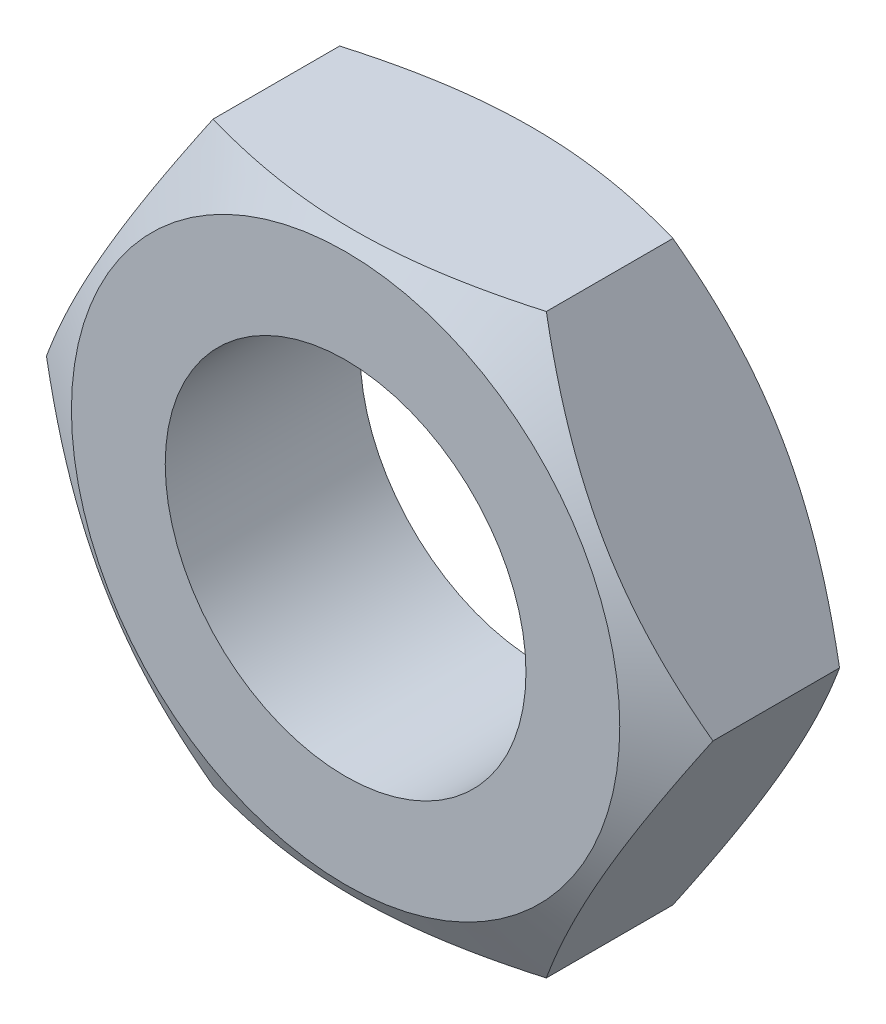
ISO-10303-21;
HEADER;
FILE_DESCRIPTION(('STEP AP214'),'2;1');
FILE_NAME('part.step','',(''),(''),'','','');
FILE_SCHEMA(('AUTOMOTIVE_DESIGN { 1 0 10303 214 1 1 1 1 }'));
ENDSEC;
DATA;
#1=APPLICATION_CONTEXT('core data for automotive mechanical design processes');
#2=APPLICATION_PROTOCOL_DEFINITION('international standard','automotive_design',2000,#1);
#3=PRODUCT_CONTEXT('',#1,'mechanical');
#4=PRODUCT('Part','Part','',(#3));
#5=PRODUCT_RELATED_PRODUCT_CATEGORY('part','',(#4));
#6=PRODUCT_DEFINITION_FORMATION('','',#4);
#7=PRODUCT_DEFINITION_CONTEXT('part definition',#1,'design');
#8=PRODUCT_DEFINITION('design','',#6,#7);
#9=PRODUCT_DEFINITION_SHAPE('','',#8);
#10=(LENGTH_UNIT() NAMED_UNIT(*) SI_UNIT(.MILLI.,.METRE.));
#11=(NAMED_UNIT(*) PLANE_ANGLE_UNIT() SI_UNIT($,.RADIAN.));
#12=(NAMED_UNIT(*) SI_UNIT($,.STERADIAN.) SOLID_ANGLE_UNIT());
#13=UNCERTAINTY_MEASURE_WITH_UNIT(LENGTH_MEASURE(1.E-05),#10,'distance_accuracy_value','');
#14=(GEOMETRIC_REPRESENTATION_CONTEXT(3) GLOBAL_UNCERTAINTY_ASSIGNED_CONTEXT((#13)) GLOBAL_UNIT_ASSIGNED_CONTEXT((#10,
#11,#12)) REPRESENTATION_CONTEXT('',''));
#15=CARTESIAN_POINT('',(0.,0.,0.));
#16=DIRECTION('',(0.,0.,1.));
#17=DIRECTION('',(1.,0.,0.));
#18=AXIS2_PLACEMENT_3D('',#15,#16,#17);
#19=CARTESIAN_POINT('',(4.618802153517,0.,-2.7));
#20=DIRECTION('',(0.866025403784439,0.5,0.));
#21=DIRECTION('',(-0.5,0.866025403784439,0.));
#22=AXIS2_PLACEMENT_3D('',#19,#20,#21);
#23=PLANE('',#22);
#24=CARTESIAN_POINT('',(4.61891762357084,-0.000199999999998459,-0.47280231291269));
#25=CARTESIAN_POINT('',(4.5174314838138,0.17557915032323,-0.414187927486206));
#26=CARTESIAN_POINT('',(4.41506932144051,0.352875616326382,-0.360880375300186));
#27=CARTESIAN_POINT('',(4.20857250547739,0.710538593175708,-0.267831724584327));
#28=CARTESIAN_POINT('',(4.10443418285646,0.890911458970152,-0.228123542867628));
#29=CARTESIAN_POINT('',(3.89744813015756,1.24942181870279,-0.166312269118203));
#30=CARTESIAN_POINT('',(3.79463224655059,1.42750415293514,-0.143797785360813));
#31=CARTESIAN_POINT('',(3.58851671999022,1.78450671716651,-0.116920676984506));
#32=CARTESIAN_POINT('',(3.48521782616117,1.9634256496441,-0.112535795264868));
#33=CARTESIAN_POINT('',(3.29219970504619,2.29774284219673,-0.121660126777895));
#34=CARTESIAN_POINT('',(3.20245157692486,2.45319115998707,-0.132929007825919));
#35=CARTESIAN_POINT('',(3.02354002635496,2.76307505563506,-0.168644044636118));
#36=CARTESIAN_POINT('',(2.93437722268072,2.91750956174413,-0.193102399549458));
#37=CARTESIAN_POINT('',(2.75509682012354,3.22803232777458,-0.254246118757214));
#38=CARTESIAN_POINT('',(2.6650019108942,3.3840812880631,-0.291190657492788));
#39=CARTESIAN_POINT('',(2.48615580200001,3.69385183540384,-0.375040126385952));
#40=CARTESIAN_POINT('',(2.39740231122585,3.84757739077378,-0.421925356050665));
#41=CARTESIAN_POINT('',(2.30928560670466,4.0002,-0.472802312912691));
#42=B_SPLINE_CURVE_WITH_KNOTS('',3,(#24,#25,#26,#27,#28,#29,#30,#31,#32,#33,#34,#35,#36,#37,#38,
#39,#40,#41),.UNSPECIFIED.,.F.,.F.,(4,2,2,2,2,2,2,2,4),(0.,0.634047835695966,1.26961969224543,
1.88946157213122,2.50854226669297,3.04757825393386,3.58711366126903,4.13861653143764,
4.68903648037743),.UNSPECIFIED.);
#43=CARTESIAN_POINT('',(4.618802153517,0.,-0.472735643746085));
#44=VERTEX_POINT('',#43);
#45=CARTESIAN_POINT('',(2.3094010767585,4.,-0.472735643746087));
#46=VERTEX_POINT('',#45);
#47=EDGE_CURVE('E53',#44,#46,#42,.T.);
#48=ORIENTED_EDGE('',*,*,#47,.F.);
#49=DIRECTION('',(0.,0.,1.));
#50=VECTOR('',#49,1.);
#51=CARTESIAN_POINT('',(4.618802153517,0.,-2.7));
#52=LINE('',#51,#50);
#53=CARTESIAN_POINT('',(4.618802153517,0.,-2.22726435625392));
#54=VERTEX_POINT('',#53);
#55=EDGE_CURVE('E12',#54,#44,#52,.T.);
#56=ORIENTED_EDGE('',*,*,#55,.F.);
#57=CARTESIAN_POINT('',(4.61891762357084,-0.00019999999999843,-2.22719768708731));
#58=CARTESIAN_POINT('',(4.5174314838138,0.17557915032323,-2.2858120725138));
#59=CARTESIAN_POINT('',(4.41506932144051,0.352875616326382,-2.33911962469982));
#60=CARTESIAN_POINT('',(4.20857250547739,0.710538593175708,-2.43216827541567));
#61=CARTESIAN_POINT('',(4.10443418285646,0.890911458970152,-2.47187645713237));
#62=CARTESIAN_POINT('',(3.89744813015756,1.24942181870279,-2.5336877308818));
#63=CARTESIAN_POINT('',(3.79463224655059,1.42750415293514,-2.55620221463919));
#64=CARTESIAN_POINT('',(3.58851671999022,1.78450671716651,-2.58307932301549));
#65=CARTESIAN_POINT('',(3.48521782616117,1.9634256496441,-2.58746420473513));
#66=CARTESIAN_POINT('',(3.29219970504619,2.29774284219673,-2.57833987322211));
#67=CARTESIAN_POINT('',(3.20245157692486,2.45319115998707,-2.56707099217408));
#68=CARTESIAN_POINT('',(3.02354002635497,2.76307505563506,-2.53135595536388));
#69=CARTESIAN_POINT('',(2.93437722268072,2.91750956174413,-2.50689760045054));
#70=CARTESIAN_POINT('',(2.75509682012354,3.22803232777458,-2.44575388124279));
#71=CARTESIAN_POINT('',(2.6650019108942,3.3840812880631,-2.40880934250721));
#72=CARTESIAN_POINT('',(2.48615580200001,3.69385183540384,-2.32495987361405));
#73=CARTESIAN_POINT('',(2.39740231122585,3.84757739077378,-2.27807464394934));
#74=CARTESIAN_POINT('',(2.30928560670466,4.0002,-2.22719768708731));
#75=B_SPLINE_CURVE_WITH_KNOTS('',3,(#57,#58,#59,#60,#61,#62,#63,#64,#65,#66,#67,#68,#69,#70,#71,
#72,#73,#74),.UNSPECIFIED.,.F.,.F.,(4,2,2,2,2,2,2,2,4),(0.,0.634047835695966,1.26961969224543,
1.88946157213122,2.50854226669297,3.04757825393385,3.58711366126903,4.13861653143763,
4.68903648037743),.UNSPECIFIED.);
#76=CARTESIAN_POINT('',(2.3094010767585,4.,-2.22726435625391));
#77=VERTEX_POINT('',#76);
#78=EDGE_CURVE('E122',#54,#77,#75,.T.);
#79=ORIENTED_EDGE('',*,*,#78,.T.);
#80=DIRECTION('',(0.,0.,1.));
#81=VECTOR('',#80,1.);
#82=CARTESIAN_POINT('',(2.3094010767585,4.,-2.7));
#83=LINE('',#82,#81);
#84=EDGE_CURVE('E40',#77,#46,#83,.T.);
#85=ORIENTED_EDGE('',*,*,#84,.T.);
#86=EDGE_LOOP('',(#48,#56,#79,#85));
#87=FACE_BOUND('',#86,.T.);
#88=ADVANCED_FACE('F36',(#87),#23,.T.);
#89=CARTESIAN_POINT('',(2.3094010767585,-4.,-2.7));
#90=DIRECTION('',(0.866025403784439,-0.5,0.));
#91=DIRECTION('',(0.5,0.866025403784439,0.));
#92=AXIS2_PLACEMENT_3D('',#89,#90,#91);
#93=PLANE('',#92);
#94=CARTESIAN_POINT('',(2.30928560670466,-4.0002,-0.47280231291269));
#95=CARTESIAN_POINT('',(2.4107717464617,-3.82442084967677,-0.414187927486206));
#96=CARTESIAN_POINT('',(2.51313390883499,-3.64712438367362,-0.360880375300186));
#97=CARTESIAN_POINT('',(2.71963072479811,-3.28946140682429,-0.267831724584327));
#98=CARTESIAN_POINT('',(2.82376904741904,-3.10908854102985,-0.228123542867628));
#99=CARTESIAN_POINT('',(3.03075510011795,-2.75057818129721,-0.166312269118203));
#100=CARTESIAN_POINT('',(3.13357098372491,-2.57249584706486,-0.143797785360812));
#101=CARTESIAN_POINT('',(3.33968651028528,-2.21549328283349,-0.116920676984505));
#102=CARTESIAN_POINT('',(3.44298540411434,-2.0365743503559,-0.112535795264867));
#103=CARTESIAN_POINT('',(3.63600352522932,-1.70225715780327,-0.121660126777894));
#104=CARTESIAN_POINT('',(3.72575165335064,-1.54680884001293,-0.132929007825917));
#105=CARTESIAN_POINT('',(3.90466320392054,-1.23692494436494,-0.168644044636116));
#106=CARTESIAN_POINT('',(3.99382600759478,-1.08249043825587,-0.193102399549456));
#107=CARTESIAN_POINT('',(4.17310641015197,-0.77196767222542,-0.254246118757213));
#108=CARTESIAN_POINT('',(4.26320131938131,-0.615918711936896,-0.291190657492786));
#109=CARTESIAN_POINT('',(4.4420474282755,-0.306148164596159,-0.37504012638595));
#110=CARTESIAN_POINT('',(4.53080091904966,-0.152422609226219,-0.421925356050663));
#111=CARTESIAN_POINT('',(4.61891762357084,0.000200000000001527,-0.472802312912689));
#112=B_SPLINE_CURVE_WITH_KNOTS('',3,(#94,#95,#96,#97,#98,#99,#100,#101,#102,#103,#104,#105,#106,
#107,#108,#109,#110,#111),.UNSPECIFIED.,.F.,.F.,(4,2,2,2,2,2,2,2,4),(0.,0.634047835695966,
1.26961969224543,1.88946157213122,2.50854226669297,3.04757825393386,3.58711366126903,
4.13861653143764,4.68903648037743),.UNSPECIFIED.);
#113=CARTESIAN_POINT('',(2.3094010767585,-4.,-0.472735643746086));
#114=VERTEX_POINT('',#113);
#115=EDGE_CURVE('E196',#114,#44,#112,.T.);
#116=ORIENTED_EDGE('',*,*,#115,.F.);
#117=DIRECTION('',(0.,0.,1.));
#118=VECTOR('',#117,1.);
#119=CARTESIAN_POINT('',(2.3094010767585,-4.,-2.7));
#120=LINE('',#119,#118);
#121=CARTESIAN_POINT('',(2.3094010767585,-4.,-2.22726435625391));
#122=VERTEX_POINT('',#121);
#123=EDGE_CURVE('E45',#122,#114,#120,.T.);
#124=ORIENTED_EDGE('',*,*,#123,.F.);
#125=CARTESIAN_POINT('',(2.30928560670466,-4.0002,-2.22719768708731));
#126=CARTESIAN_POINT('',(2.4107717464617,-3.82442084967677,-2.28581207251379));
#127=CARTESIAN_POINT('',(2.51313390883499,-3.64712438367362,-2.33911962469981));
#128=CARTESIAN_POINT('',(2.71963072479811,-3.28946140682429,-2.43216827541567));
#129=CARTESIAN_POINT('',(2.82376904741904,-3.10908854102985,-2.47187645713237));
#130=CARTESIAN_POINT('',(3.03075510011795,-2.75057818129721,-2.5336877308818));
#131=CARTESIAN_POINT('',(3.13357098372491,-2.57249584706486,-2.55620221463919));
#132=CARTESIAN_POINT('',(3.33968651028528,-2.21549328283349,-2.5830793230155));
#133=CARTESIAN_POINT('',(3.44298540411434,-2.0365743503559,-2.58746420473513));
#134=CARTESIAN_POINT('',(3.63600352522932,-1.70225715780327,-2.57833987322211));
#135=CARTESIAN_POINT('',(3.72575165335064,-1.54680884001293,-2.56707099217408));
#136=CARTESIAN_POINT('',(3.90466320392054,-1.23692494436494,-2.53135595536388));
#137=CARTESIAN_POINT('',(3.99382600759478,-1.08249043825587,-2.50689760045054));
#138=CARTESIAN_POINT('',(4.17310641015197,-0.77196767222542,-2.44575388124279));
#139=CARTESIAN_POINT('',(4.26320131938131,-0.615918711936896,-2.40880934250721));
#140=CARTESIAN_POINT('',(4.4420474282755,-0.306148164596159,-2.32495987361405));
#141=CARTESIAN_POINT('',(4.53080091904966,-0.152422609226219,-2.27807464394934));
#142=CARTESIAN_POINT('',(4.61891762357084,0.000200000000001746,-2.22719768708731));
#143=B_SPLINE_CURVE_WITH_KNOTS('',3,(#125,#126,#127,#128,#129,#130,#131,#132,#133,#134,#135,
#136,#137,#138,#139,#140,#141,#142),.UNSPECIFIED.,.F.,.F.,(4,2,2,2,2,2,2,2,4),(0.,
0.634047835695966,1.26961969224543,1.88946157213122,2.50854226669297,3.04757825393386,
3.58711366126903,4.13861653143764,4.68903648037743),.UNSPECIFIED.);
#144=EDGE_CURVE('E132',#122,#54,#143,.T.);
#145=ORIENTED_EDGE('',*,*,#144,.T.);
#146=ORIENTED_EDGE('',*,*,#55,.T.);
#147=EDGE_LOOP('',(#116,#124,#145,#146));
#148=FACE_BOUND('',#147,.T.);
#149=ADVANCED_FACE('F181',(#148),#93,.T.);
#150=CARTESIAN_POINT('',(2.3094010767585,-4.,-2.7));
#151=DIRECTION('',(0.,1.,0.));
#152=DIRECTION('',(0.,0.,1.));
#153=AXIS2_PLACEMENT_3D('',#150,#151,#152);
#154=PLANE('',#153);
#155=ORIENTED_EDGE('',*,*,#123,.T.);
#156=CARTESIAN_POINT('',(-6.22306666389013,-4.,-2.07715621973869));
#157=CARTESIAN_POINT('',(-6.04816316083585,-4.,-1.99223318627449));
#158=CARTESIAN_POINT('',(-5.87286020291232,-4.,-1.90811886121569));
#159=CARTESIAN_POINT('',(-5.5212429655653,-4.,-1.74196217470627));
#160=CARTESIAN_POINT('',(-5.34492853369369,-4.,-1.65992013622249));
#161=CARTESIAN_POINT('',(-4.99017731988395,-4.,-1.49795420776188));
#162=CARTESIAN_POINT('',(-4.81173422178917,-4.,-1.41804410452791));
#163=CARTESIAN_POINT('',(-4.45343527633052,-4.,-1.26146879437188));
#164=CARTESIAN_POINT('',(-4.27357949568487,-4.,-1.18480343528648));
#165=CARTESIAN_POINT('',(-3.90635209147069,-4.,-1.03317192694685));
#166=CARTESIAN_POINT('',(-3.71892482760879,-4.,-0.958339799325904));
#167=CARTESIAN_POINT('',(-3.34188498996632,-4.,-0.814291513798155));
#168=CARTESIAN_POINT('',(-3.1522721748219,-4.,-0.745075983086222));
#169=CARTESIAN_POINT('',(-2.7709078599298,-4.,-0.614062975376169));
#170=CARTESIAN_POINT('',(-2.57916150632359,-4.,-0.552250667975138));
#171=CARTESIAN_POINT('',(-2.1929186258398,-4.,-0.438014245597993));
#172=CARTESIAN_POINT('',(-1.99842297921743,-4.,-0.385587196004615));
#173=CARTESIAN_POINT('',(-1.60762158446245,-4.,-0.292895792064873));
#174=CARTESIAN_POINT('',(-1.41133146944543,-4.,-0.25256673462777));
#175=CARTESIAN_POINT('',(-1.01629017268319,-4.,-0.186348847408301));
#176=CARTESIAN_POINT('',(-0.817539241744451,-4.,-0.160458558210126));
#177=CARTESIAN_POINT('',(-0.421174309879175,-4.,-0.125521614096426));
#178=CARTESIAN_POINT('',(-0.223580028282138,-4.,-0.116256755578083));
#179=CARTESIAN_POINT('',(0.171690953606563,-4.,-0.114780507489012));
#180=CARTESIAN_POINT('',(0.369367655898419,-4.,-0.122569559160006));
#181=CARTESIAN_POINT('',(0.70432384981034,-4.,-0.149664220842452));
#182=CARTESIAN_POINT('',(0.841959713914111,-4.,-0.164821678851629));
#183=CARTESIAN_POINT('',(1.11623127793625,-4.,-0.202471791988035));
#184=CARTESIAN_POINT('',(1.25286684218125,-4.,-0.224965423961957));
#185=CARTESIAN_POINT('',(1.66108240597982,-4.,-0.302268998836937));
#186=CARTESIAN_POINT('',(1.93082590922622,-4.,-0.366888293804209));
#187=CARTESIAN_POINT('',(2.33430322321429,-4.,-0.479059503376214));
#188=CARTESIAN_POINT('',(2.47012356918847,-4.,-0.519534112438021));
#189=CARTESIAN_POINT('',(2.74044446929553,-4.,-0.604712309553022));
#190=CARTESIAN_POINT('',(2.87494501374186,-4.,-0.649415928618981));
#191=CARTESIAN_POINT('',(3.142670047311,-4.,-0.742332478472642));
#192=CARTESIAN_POINT('',(3.27589492259067,-4.,-0.790544306678611));
#193=CARTESIAN_POINT('',(3.54123753060719,-4.,-0.889907385876161));
#194=CARTESIAN_POINT('',(3.67335528495113,-4.,-0.941058579347892));
#195=CARTESIAN_POINT('',(4.01817238998952,-4.,-1.07826440943816));
#196=CARTESIAN_POINT('',(4.23007941260878,-4.,-1.16630801904257));
#197=CARTESIAN_POINT('',(4.65182404632047,-4.,-1.34723580780935));
#198=CARTESIAN_POINT('',(4.86166145991219,-4.,-1.44012044373115));
#199=CARTESIAN_POINT('',(5.27971562078395,-4.,-1.62962054571552));
#200=CARTESIAN_POINT('',(5.48793186177941,-4.,-1.72623712519084));
#201=CARTESIAN_POINT('',(5.90300704483654,-4.,-1.92234882491253));
#202=CARTESIAN_POINT('',(6.10986594942563,-4.,-2.02184402422342));
#203=CARTESIAN_POINT('',(6.522766422381,-4.,-2.22324245325465));
#204=CARTESIAN_POINT('',(6.72880643107999,-4.,-2.32514887436245));
#205=CARTESIAN_POINT('',(7.13997678264673,-4.,-2.5307824539104));
#206=CARTESIAN_POINT('',(7.34510711645957,-4.,-2.63450963042362));
#207=CARTESIAN_POINT('',(7.95929985262222,-4.,-2.94784175824627));
#208=CARTESIAN_POINT('',(8.36724448010055,-4.,-3.15963693324092));
#209=CARTESIAN_POINT('',(9.14032301551453,-4.,-3.5657751899058));
#210=CARTESIAN_POINT('',(9.50565490265404,-4.,-3.75974318749868));
#211=CARTESIAN_POINT('',(10.2350775945187,-4.,-4.15004385802247));
#212=CARTESIAN_POINT('',(10.5991683322628,-4.,-4.34637665606111));
#213=CARTESIAN_POINT('',(11.3252824478946,-4.,-4.74020058273108));
#214=CARTESIAN_POINT('',(11.687308743492,-4.,-4.93768634018559));
#215=CARTESIAN_POINT('',(12.4105844713828,-4.,-5.3340156973512));
#216=CARTESIAN_POINT('',(12.7718339565996,-4.,-5.53285920044096));
#217=CARTESIAN_POINT('',(13.132807420356,-4.,-5.73219940623917));
#218=B_SPLINE_CURVE_WITH_KNOTS('',3,(#156,#157,#158,#159,#160,#161,#162,#163,#164,#165,#166,
#167,#168,#169,#170,#171,#172,#173,#174,#175,#176,#177,#178,#179,#180,#181,#182,#183,#184,#185,
#186,#187,#188,#189,#190,#191,#192,#193,#194,#195,#196,#197,#198,#199,#200,#201,#202,#203,#204,
#205,#206,#207,#208,#209,#210,#211,#212,#213,#214,#215,#216,#217),.UNSPECIFIED.,.F.,.F.,(4,2,2,
2,2,2,2,2,2,2,2,2,2,2,2,2,2,2,2,2,2,2,2,2,2,2,2,2,2,2,4),(0.,0.583298057032648,1.16668646733312,
1.75321670401812,2.3397194046287,2.94509134661158,3.55053079658478,4.15473637009889,
4.75875268711562,5.35947849004896,5.96014356289174,6.55286577811161,7.14560332921982,
7.56080635419075,7.97606468801973,8.80701729814528,9.2321492716616,9.65728436305649,
10.0822864126958,10.5072801483854,11.1956006655692,11.8839862450047,12.5725788127679,
13.2611903114875,13.9507707688599,14.6403580749825,16.0192635693966,17.2601489781786,
18.5011003258178,19.7382605155364,20.9753335641087),.UNSPECIFIED.);
#219=CARTESIAN_POINT('',(-2.3094010767585,-4.,-0.472735643746087));
#220=VERTEX_POINT('',#219);
#221=EDGE_CURVE('E188',#114,#220,#218,.F.);
#222=ORIENTED_EDGE('',*,*,#221,.T.);
#223=DIRECTION('',(0.,0.,1.));
#224=VECTOR('',#223,1.);
#225=CARTESIAN_POINT('',(-2.3094010767585,-4.,-2.7));
#226=LINE('',#225,#224);
#227=CARTESIAN_POINT('',(-2.3094010767585,-4.,-2.22726435625391));
#228=VERTEX_POINT('',#227);
#229=EDGE_CURVE('E111',#228,#220,#226,.T.);
#230=ORIENTED_EDGE('',*,*,#229,.F.);
#231=CARTESIAN_POINT('',(-6.23116690477721,-4.,-0.618908956888226));
#232=CARTESIAN_POINT('',(-6.0561946941632,-4.,-0.703897707125557));
#233=CARTESIAN_POINT('',(-5.88082373593584,-4.,-0.788079445159984));
#234=CARTESIAN_POINT('',(-5.52907231975997,-4.,-0.954375464821885));
#235=CARTESIAN_POINT('',(-5.35269171036528,-4.,-1.03648942575282));
#236=CARTESIAN_POINT('',(-4.99781388162299,-4.,-1.19860345902988));
#237=CARTESIAN_POINT('',(-4.81931038407348,-4.,-1.27858983496516));
#238=CARTESIAN_POINT('',(-4.46089298231089,-4.,-1.43532530406313));
#239=CARTESIAN_POINT('',(-4.28097914446722,-4.,-1.51207454849075));
#240=CARTESIAN_POINT('',(-3.91360487149529,-4.,-1.66389947037554));
#241=CARTESIAN_POINT('',(-3.7260885749077,-4.,-1.73884070907987));
#242=CARTESIAN_POINT('',(-3.34887263096449,-4.,-1.88311842742219));
#243=CARTESIAN_POINT('',(-3.15917274290169,-4.,-1.95245428226145));
#244=CARTESIAN_POINT('',(-2.77763368855128,-4.,-2.08372190891206));
#245=CARTESIAN_POINT('',(-2.58579964231918,-4.,-2.14566841447991));
#246=CARTESIAN_POINT('',(-2.19938014764704,-4.,-2.26018825512826));
#247=CARTESIAN_POINT('',(-2.00479557724391,-4.,-2.31276451161685));
#248=CARTESIAN_POINT('',(-1.61381745440774,-4.,-2.40576625432492));
#249=CARTESIAN_POINT('',(-1.41743964076501,-4.,-2.44625669535145));
#250=CARTESIAN_POINT('',(-1.0222134745139,-4.,-2.51280607626363));
#251=CARTESIAN_POINT('',(-0.823365376182103,-4.,-2.53886648911134));
#252=CARTESIAN_POINT('',(-0.426801625733816,-4.,-2.57413693322722));
#253=CARTESIAN_POINT('',(-0.22910593639676,-4.,-2.58356588096561));
#254=CARTESIAN_POINT('',(0.166381594886168,-4.,-2.58535204511412));
#255=CARTESIAN_POINT('',(0.364173439104715,-4.,-2.57770883622481));
#256=CARTESIAN_POINT('',(0.69908745932346,-4.,-2.55085582248368));
#257=CARTESIAN_POINT('',(0.836564945582611,-4.,-2.53581620044038));
#258=CARTESIAN_POINT('',(1.11052618942443,-4.,-2.49840990747991));
#259=CARTESIAN_POINT('',(1.24700981314823,-4.,-2.47604226758359));
#260=CARTESIAN_POINT('',(1.65477641349246,-4.,-2.39912173334962));
#261=CARTESIAN_POINT('',(1.92423117097824,-4.,-2.33476431033712));
#262=CARTESIAN_POINT('',(2.32728742895189,-4.,-2.22298005561859));
#263=CARTESIAN_POINT('',(2.46297151296575,-4.,-2.18263358346936));
#264=CARTESIAN_POINT('',(2.73302137589088,-4.,-2.0977080856257));
#265=CARTESIAN_POINT('',(2.8673871450606,-4.,-2.05312902868096));
#266=CARTESIAN_POINT('',(3.13484378532378,-4.,-1.96045741819594));
#267=CARTESIAN_POINT('',(3.26793503781221,-4.,-1.91236595541695));
#268=CARTESIAN_POINT('',(3.53301035484716,-4.,-1.81323968343534));
#269=CARTESIAN_POINT('',(3.66499444155406,-4.,-1.76220493330563));
#270=CARTESIAN_POINT('',(4.01125776737216,-4.,-1.6245855411967));
#271=CARTESIAN_POINT('',(4.2247228160942,-4.,-1.53595457481386));
#272=CARTESIAN_POINT('',(4.6495510063104,-4.,-1.35377400656659));
#273=CARTESIAN_POINT('',(4.860913942036,-4.,-1.26022392871418));
#274=CARTESIAN_POINT('',(5.28199711798421,-4.,-1.06933972373572));
#275=CARTESIAN_POINT('',(5.49171683280113,-4.,-0.972004441248266));
#276=CARTESIAN_POINT('',(5.90978176567902,-4.,-0.774419708887438));
#277=CARTESIAN_POINT('',(6.11812694516307,-4.,-0.674170177647712));
#278=CARTESIAN_POINT('',(6.53399444984484,-4.,-0.471235123130598));
#279=CARTESIAN_POINT('',(6.74151517142242,-4.,-0.368546320031498));
#280=CARTESIAN_POINT('',(7.15563784023437,-4.,-0.16133067091403));
#281=CARTESIAN_POINT('',(7.36223977823949,-4.,-0.0568038064842186));
#282=CARTESIAN_POINT('',(7.98083515251787,-4.,0.25894414014919));
#283=CARTESIAN_POINT('',(8.39170103039797,-4.,0.47237339907072));
#284=CARTESIAN_POINT('',(9.16993555316001,-4.,0.881439154059585));
#285=CARTESIAN_POINT('',(9.5375052587993,-4.,1.07669493951856));
#286=CARTESIAN_POINT('',(10.2713996765586,-4.,1.46957877325565));
#287=CARTESIAN_POINT('',(10.6377243198534,-4.,1.66720695002492));
#288=CARTESIAN_POINT('',(11.3682815563623,-4.,2.06361307398719));
#289=CARTESIAN_POINT('',(11.7325171150585,-4.,2.26238556443952));
#290=CARTESIAN_POINT('',(12.4602094115904,-4.,2.66129000186063));
#291=CARTESIAN_POINT('',(12.8236662033603,-4.,2.86142185040107));
#292=CARTESIAN_POINT('',(13.18684679783,-4.,3.06205055216779));
#293=B_SPLINE_CURVE_WITH_KNOTS('',3,(#231,#232,#233,#234,#235,#236,#237,#238,#239,#240,#241,
#242,#243,#244,#245,#246,#247,#248,#249,#250,#251,#252,#253,#254,#255,#256,#257,#258,#259,#260,
#261,#262,#263,#264,#265,#266,#267,#268,#269,#270,#271,#272,#273,#274,#275,#276,#277,#278,#279,
#280,#281,#282,#283,#284,#285,#286,#287,#288,#289,#290,#291,#292),.UNSPECIFIED.,.F.,.F.,(4,2,2,
2,2,2,2,2,2,2,2,2,2,2,2,2,2,2,2,2,2,2,2,2,2,2,2,2,2,2,4),(0.,0.583569560665296,1.16722907796292,
1.75401834875113,2.34078016955861,2.94652188370419,3.5523310234427,4.15691128970906,
4.76130273204318,5.36238485208926,5.96340560465612,6.55645449555858,7.14951816058548,
7.56421071764592,7.97895813138545,8.80888461393811,9.23351492126433,9.65814836399257,
10.0826504949282,10.5071441089063,11.2004545200236,11.8938321418332,12.5874230911347,
13.2810334242557,13.975636056921,14.6702456512313,16.0591877003369,17.307814365389,
18.5565089652371,19.8013361638165,21.0460741679865),.UNSPECIFIED.);
#294=EDGE_CURVE('E171',#122,#228,#293,.F.);
#295=ORIENTED_EDGE('',*,*,#294,.F.);
#296=EDGE_LOOP('',(#155,#222,#230,#295));
#297=FACE_BOUND('',#296,.T.);
#298=ADVANCED_FACE('F177',(#297),#154,.F.);
#299=CARTESIAN_POINT('',(-4.618802153517,0.,-2.7));
#300=DIRECTION('',(-0.866025403784439,-0.499999999999999,0.));
#301=DIRECTION('',(0.5,-0.866025403784439,0.));
#302=AXIS2_PLACEMENT_3D('',#299,#300,#301);
#303=PLANE('',#302);
#304=CARTESIAN_POINT('',(-4.61891762357084,0.000200000000001647,-0.47280231291269));
#305=CARTESIAN_POINT('',(-4.5174314838138,-0.175579150323226,-0.414187927486206));
#306=CARTESIAN_POINT('',(-4.41506932144051,-0.352875616326379,-0.360880375300186));
#307=CARTESIAN_POINT('',(-4.20857250547739,-0.710538593175705,-0.267831724584327));
#308=CARTESIAN_POINT('',(-4.10443418285647,-0.890911458970149,-0.228123542867628));
#309=CARTESIAN_POINT('',(-3.89744813015756,-1.24942181870279,-0.166312269118203));
#310=CARTESIAN_POINT('',(-3.79463224655059,-1.42750415293514,-0.143797785360813));
#311=CARTESIAN_POINT('',(-3.58851671999023,-1.78450671716651,-0.116920676984506));
#312=CARTESIAN_POINT('',(-3.48521782616117,-1.9634256496441,-0.112535795264867));
#313=CARTESIAN_POINT('',(-3.29219970504619,-2.29774284219673,-0.121660126777894));
#314=CARTESIAN_POINT('',(-3.20245157692486,-2.45319115998706,-0.132929007825918));
#315=CARTESIAN_POINT('',(-3.02354002635497,-2.76307505563505,-0.168644044636117));
#316=CARTESIAN_POINT('',(-2.93437722268072,-2.91750956174413,-0.193102399549457));
#317=CARTESIAN_POINT('',(-2.75509682012354,-3.22803232777458,-0.254246118757213));
#318=CARTESIAN_POINT('',(-2.6650019108942,-3.3840812880631,-0.291190657492787));
#319=CARTESIAN_POINT('',(-2.48615580200001,-3.69385183540384,-0.375040126385951));
#320=CARTESIAN_POINT('',(-2.39740231122585,-3.84757739077378,-0.421925356050664));
#321=CARTESIAN_POINT('',(-2.30928560670467,-4.0002,-0.472802312912691));
#322=B_SPLINE_CURVE_WITH_KNOTS('',3,(#304,#305,#306,#307,#308,#309,#310,#311,#312,#313,#314,
#315,#316,#317,#318,#319,#320,#321),.UNSPECIFIED.,.F.,.F.,(4,2,2,2,2,2,2,2,4),(0.,
0.634047835695965,1.26961969224543,1.88946157213122,2.50854226669297,3.04757825393385,
3.58711366126903,4.13861653143763,4.68903648037743),.UNSPECIFIED.);
#323=CARTESIAN_POINT('',(-4.618802153517,0.,-0.472735643746086));
#324=VERTEX_POINT('',#323);
#325=EDGE_CURVE('E107',#324,#220,#322,.T.);
#326=ORIENTED_EDGE('',*,*,#325,.F.);
#327=DIRECTION('',(0.,0.,1.));
#328=VECTOR('',#327,1.);
#329=CARTESIAN_POINT('',(-4.618802153517,0.,-2.7));
#330=LINE('',#329,#328);
#331=CARTESIAN_POINT('',(-4.618802153517,0.,-2.22726435625392));
#332=VERTEX_POINT('',#331);
#333=EDGE_CURVE('E106',#332,#324,#330,.T.);
#334=ORIENTED_EDGE('',*,*,#333,.F.);
#335=CARTESIAN_POINT('',(-4.61891762357084,0.000200000000001618,-2.22719768708731));
#336=CARTESIAN_POINT('',(-4.5174314838138,-0.175579150323226,-2.2858120725138));
#337=CARTESIAN_POINT('',(-4.41506932144051,-0.352875616326379,-2.33911962469982));
#338=CARTESIAN_POINT('',(-4.20857250547739,-0.710538593175705,-2.43216827541567));
#339=CARTESIAN_POINT('',(-4.10443418285646,-0.890911458970149,-2.47187645713237));
#340=CARTESIAN_POINT('',(-3.89744813015756,-1.24942181870279,-2.5336877308818));
#341=CARTESIAN_POINT('',(-3.79463224655059,-1.42750415293514,-2.55620221463919));
#342=CARTESIAN_POINT('',(-3.58851671999023,-1.78450671716651,-2.58307932301549));
#343=CARTESIAN_POINT('',(-3.48521782616117,-1.9634256496441,-2.58746420473513));
#344=CARTESIAN_POINT('',(-3.29219970504619,-2.29774284219673,-2.57833987322211));
#345=CARTESIAN_POINT('',(-3.20245157692486,-2.45319115998706,-2.56707099217408));
#346=CARTESIAN_POINT('',(-3.02354002635497,-2.76307505563505,-2.53135595536388));
#347=CARTESIAN_POINT('',(-2.93437722268073,-2.91750956174413,-2.50689760045054));
#348=CARTESIAN_POINT('',(-2.75509682012354,-3.22803232777458,-2.44575388124279));
#349=CARTESIAN_POINT('',(-2.6650019108942,-3.3840812880631,-2.40880934250721));
#350=CARTESIAN_POINT('',(-2.48615580200001,-3.69385183540384,-2.32495987361405));
#351=CARTESIAN_POINT('',(-2.39740231122585,-3.84757739077378,-2.27807464394934));
#352=CARTESIAN_POINT('',(-2.30928560670467,-4.0002,-2.22719768708731));
#353=B_SPLINE_CURVE_WITH_KNOTS('',3,(#335,#336,#337,#338,#339,#340,#341,#342,#343,#344,#345,
#346,#347,#348,#349,#350,#351,#352),.UNSPECIFIED.,.F.,.F.,(4,2,2,2,2,2,2,2,4),(0.,
0.634047835695966,1.26961969224543,1.88946157213122,2.50854226669297,3.04757825393386,
3.58711366126903,4.13861653143763,4.68903648037743),.UNSPECIFIED.);
#354=EDGE_CURVE('E165',#332,#228,#353,.T.);
#355=ORIENTED_EDGE('',*,*,#354,.T.);
#356=ORIENTED_EDGE('',*,*,#229,.T.);
#357=EDGE_LOOP('',(#326,#334,#355,#356));
#358=FACE_BOUND('',#357,.T.);
#359=ADVANCED_FACE('F180',(#358),#303,.T.);
#360=CARTESIAN_POINT('',(-2.3094010767585,4.,-2.7));
#361=DIRECTION('',(-0.866025403784439,0.5,0.));
#362=DIRECTION('',(-0.5,-0.866025403784439,0.));
#363=AXIS2_PLACEMENT_3D('',#360,#361,#362);
#364=PLANE('',#363);
#365=CARTESIAN_POINT('',(-2.30928560670467,4.0002,-0.472802312912692));
#366=CARTESIAN_POINT('',(-2.4107717464617,3.82442084967677,-0.414187927486207));
#367=CARTESIAN_POINT('',(-2.51313390883499,3.64712438367362,-0.360880375300188));
#368=CARTESIAN_POINT('',(-2.71963072479811,3.28946140682429,-0.267831724584329));
#369=CARTESIAN_POINT('',(-2.82376904741904,3.10908854102985,-0.228123542867629));
#370=CARTESIAN_POINT('',(-3.03075510011795,2.75057818129721,-0.166312269118204));
#371=CARTESIAN_POINT('',(-3.13357098372492,2.57249584706486,-0.143797785360814));
#372=CARTESIAN_POINT('',(-3.33968651028528,2.21549328283349,-0.116920676984506));
#373=CARTESIAN_POINT('',(-3.44298540411434,2.0365743503559,-0.112535795264868));
#374=CARTESIAN_POINT('',(-3.63600352522932,1.70225715780327,-0.121660126777895));
#375=CARTESIAN_POINT('',(-3.72575165335065,1.54680884001293,-0.132929007825919));
#376=CARTESIAN_POINT('',(-3.90466320392054,1.23692494436494,-0.168644044636118));
#377=CARTESIAN_POINT('',(-3.99382600759478,1.08249043825587,-0.193102399549457));
#378=CARTESIAN_POINT('',(-4.17310641015197,0.771967672225422,-0.254246118757213));
#379=CARTESIAN_POINT('',(-4.26320131938131,0.615918711936898,-0.291190657492787));
#380=CARTESIAN_POINT('',(-4.4420474282755,0.306148164596162,-0.37504012638595));
#381=CARTESIAN_POINT('',(-4.53080091904966,0.152422609226222,-0.421925356050664));
#382=CARTESIAN_POINT('',(-4.61891762357084,-0.000199999999998689,-0.47280231291269));
#383=B_SPLINE_CURVE_WITH_KNOTS('',3,(#365,#366,#367,#368,#369,#370,#371,#372,#373,#374,#375,
#376,#377,#378,#379,#380,#381,#382),.UNSPECIFIED.,.F.,.F.,(4,2,2,2,2,2,2,2,4),(0.,
0.634047835695966,1.26961969224543,1.88946157213122,2.50854226669297,3.04757825393386,
3.58711366126903,4.13861653143764,4.68903648037743),.UNSPECIFIED.);
#384=CARTESIAN_POINT('',(-2.309401076759,4.,-0.472735643745756));
#385=VERTEX_POINT('',#384);
#386=EDGE_CURVE('E92',#385,#324,#383,.T.);
#387=ORIENTED_EDGE('',*,*,#386,.F.);
#388=DIRECTION('',(0.,0.,1.));
#389=VECTOR('',#388,1.);
#390=CARTESIAN_POINT('',(-2.3094010767585,4.,-2.7));
#391=LINE('',#390,#389);
#392=CARTESIAN_POINT('',(-2.3094010767585,4.,-2.22726435625391));
#393=VERTEX_POINT('',#392);
#394=EDGE_CURVE('E104',#393,#385,#391,.T.);
#395=ORIENTED_EDGE('',*,*,#394,.F.);
#396=CARTESIAN_POINT('',(-2.30928560670467,4.0002,-2.22719768708731));
#397=CARTESIAN_POINT('',(-2.4107717464617,3.82442084967677,-2.28581207251379));
#398=CARTESIAN_POINT('',(-2.51313390883499,3.64712438367362,-2.33911962469981));
#399=CARTESIAN_POINT('',(-2.71963072479811,3.28946140682429,-2.43216827541567));
#400=CARTESIAN_POINT('',(-2.82376904741904,3.10908854102985,-2.47187645713237));
#401=CARTESIAN_POINT('',(-3.03075510011795,2.75057818129721,-2.5336877308818));
#402=CARTESIAN_POINT('',(-3.13357098372492,2.57249584706486,-2.55620221463919));
#403=CARTESIAN_POINT('',(-3.33968651028528,2.21549328283349,-2.58307932301549));
#404=CARTESIAN_POINT('',(-3.44298540411434,2.0365743503559,-2.58746420473513));
#405=CARTESIAN_POINT('',(-3.63600352522932,1.70225715780327,-2.57833987322211));
#406=CARTESIAN_POINT('',(-3.72575165335064,1.54680884001293,-2.56707099217408));
#407=CARTESIAN_POINT('',(-3.90466320392054,1.23692494436494,-2.53135595536388));
#408=CARTESIAN_POINT('',(-3.99382600759478,1.08249043825587,-2.50689760045054));
#409=CARTESIAN_POINT('',(-4.17310641015197,0.771967672225422,-2.44575388124279));
#410=CARTESIAN_POINT('',(-4.26320131938131,0.615918711936899,-2.40880934250721));
#411=CARTESIAN_POINT('',(-4.4420474282755,0.306148164596162,-2.32495987361405));
#412=CARTESIAN_POINT('',(-4.53080091904966,0.152422609226222,-2.27807464394934));
#413=CARTESIAN_POINT('',(-4.61891762357084,-0.000199999999998686,-2.22719768708731));
#414=B_SPLINE_CURVE_WITH_KNOTS('',3,(#396,#397,#398,#399,#400,#401,#402,#403,#404,#405,#406,
#407,#408,#409,#410,#411,#412,#413),.UNSPECIFIED.,.F.,.F.,(4,2,2,2,2,2,2,2,4),(0.,
0.634047835695966,1.26961969224543,1.88946157213122,2.50854226669297,3.04757825393386,
3.58711366126903,4.13861653143763,4.68903648037743),.UNSPECIFIED.);
#415=EDGE_CURVE('E61',#393,#332,#414,.T.);
#416=ORIENTED_EDGE('',*,*,#415,.T.);
#417=ORIENTED_EDGE('',*,*,#333,.T.);
#418=EDGE_LOOP('',(#387,#395,#416,#417));
#419=FACE_BOUND('',#418,.T.);
#420=ADVANCED_FACE('F103',(#419),#364,.T.);
#421=CARTESIAN_POINT('',(2.3094010767585,4.,-2.7));
#422=DIRECTION('',(0.,1.,0.));
#423=DIRECTION('',(0.,0.,1.));
#424=AXIS2_PLACEMENT_3D('',#421,#422,#423);
#425=PLANE('',#424);
#426=CARTESIAN_POINT('',(-6.22306666389013,4.,-2.0771562197387));
#427=CARTESIAN_POINT('',(-6.04816316083585,4.,-1.9922331862745));
#428=CARTESIAN_POINT('',(-5.87286020291232,4.,-1.90811886121569));
#429=CARTESIAN_POINT('',(-5.52124296556531,4.,-1.74196217470627));
#430=CARTESIAN_POINT('',(-5.34492853369369,4.,-1.65992013622249));
#431=CARTESIAN_POINT('',(-4.99017731988396,4.,-1.49795420776188));
#432=CARTESIAN_POINT('',(-4.81173422178917,4.,-1.41804410452791));
#433=CARTESIAN_POINT('',(-4.45343527633052,4.,-1.26146879437188));
#434=CARTESIAN_POINT('',(-4.27357949568488,4.,-1.18480343528648));
#435=CARTESIAN_POINT('',(-3.90635209147069,4.,-1.03317192694685));
#436=CARTESIAN_POINT('',(-3.71892482760879,4.,-0.958339799325906));
#437=CARTESIAN_POINT('',(-3.34188498996632,4.,-0.814291513798157));
#438=CARTESIAN_POINT('',(-3.1522721748219,4.,-0.745075983086224));
#439=CARTESIAN_POINT('',(-2.7709078599298,4.,-0.61406297537617));
#440=CARTESIAN_POINT('',(-2.57916150632359,4.,-0.552250667975139));
#441=CARTESIAN_POINT('',(-2.1929186258398,4.,-0.438014245597994));
#442=CARTESIAN_POINT('',(-1.99842297921743,4.,-0.385587196004616));
#443=CARTESIAN_POINT('',(-1.60762158446245,4.,-0.292895792064874));
#444=CARTESIAN_POINT('',(-1.41133146944543,4.,-0.252566734627771));
#445=CARTESIAN_POINT('',(-1.01629017268319,4.,-0.186348847408301));
#446=CARTESIAN_POINT('',(-0.817539241744451,4.,-0.160458558210127));
#447=CARTESIAN_POINT('',(-0.421174309879175,4.,-0.125521614096427));
#448=CARTESIAN_POINT('',(-0.223580028282137,4.,-0.116256755578085));
#449=CARTESIAN_POINT('',(0.171690953606563,4.,-0.114780507489013));
#450=CARTESIAN_POINT('',(0.36936765589842,4.,-0.122569559160007));
#451=CARTESIAN_POINT('',(0.704323849810341,4.,-0.149664220842453));
#452=CARTESIAN_POINT('',(0.841959713914112,4.,-0.16482167885163));
#453=CARTESIAN_POINT('',(1.11623127793625,4.,-0.202471791988036));
#454=CARTESIAN_POINT('',(1.25286684218125,4.,-0.224965423961958));
#455=CARTESIAN_POINT('',(1.66108240597983,4.,-0.302268998836938));
#456=CARTESIAN_POINT('',(1.93082590922622,4.,-0.366888293804211));
#457=CARTESIAN_POINT('',(2.33430322321429,4.,-0.479059503376215));
#458=CARTESIAN_POINT('',(2.47012356918847,4.,-0.519534112438021));
#459=CARTESIAN_POINT('',(2.74044446929553,4.,-0.604712309553023));
#460=CARTESIAN_POINT('',(2.87494501374186,4.,-0.649415928618982));
#461=CARTESIAN_POINT('',(3.142670047311,4.,-0.742332478472644));
#462=CARTESIAN_POINT('',(3.27589492259067,4.,-0.790544306678612));
#463=CARTESIAN_POINT('',(3.54123753060719,4.,-0.889907385876162));
#464=CARTESIAN_POINT('',(3.67335528495113,4.,-0.941058579347893));
#465=CARTESIAN_POINT('',(4.01817238998952,4.,-1.07826440943816));
#466=CARTESIAN_POINT('',(4.23007941260879,4.,-1.16630801904257));
#467=CARTESIAN_POINT('',(4.65182404632047,4.,-1.34723580780935));
#468=CARTESIAN_POINT('',(4.8616614599122,4.,-1.44012044373115));
#469=CARTESIAN_POINT('',(5.27971562078396,4.,-1.62962054571553));
#470=CARTESIAN_POINT('',(5.48793186177942,4.,-1.72623712519084));
#471=CARTESIAN_POINT('',(5.90300704483654,4.,-1.92234882491253));
#472=CARTESIAN_POINT('',(6.10986594942563,4.,-2.02184402422343));
#473=CARTESIAN_POINT('',(6.52276642238101,4.,-2.22324245325465));
#474=CARTESIAN_POINT('',(6.72880643108,4.,-2.32514887436245));
#475=CARTESIAN_POINT('',(7.13997678264673,4.,-2.5307824539104));
#476=CARTESIAN_POINT('',(7.34510711645957,4.,-2.63450963042363));
#477=CARTESIAN_POINT('',(7.95929985262223,4.,-2.94784175824628));
#478=CARTESIAN_POINT('',(8.36724448010056,4.,-3.15963693324092));
#479=CARTESIAN_POINT('',(9.14032301551454,4.,-3.56577518990581));
#480=CARTESIAN_POINT('',(9.50565490265405,4.,-3.75974318749868));
#481=CARTESIAN_POINT('',(10.2350775945187,4.,-4.15004385802247));
#482=CARTESIAN_POINT('',(10.5991683322629,4.,-4.34637665606111));
#483=CARTESIAN_POINT('',(11.3252824478946,4.,-4.74020058273108));
#484=CARTESIAN_POINT('',(11.687308743492,4.,-4.93768634018559));
#485=CARTESIAN_POINT('',(12.4105844713828,4.,-5.33401569735121));
#486=CARTESIAN_POINT('',(12.7718339565996,4.,-5.53285920044097));
#487=CARTESIAN_POINT('',(13.132807420356,4.,-5.73219940623917));
#488=B_SPLINE_CURVE_WITH_KNOTS('',3,(#426,#427,#428,#429,#430,#431,#432,#433,#434,#435,#436,
#437,#438,#439,#440,#441,#442,#443,#444,#445,#446,#447,#448,#449,#450,#451,#452,#453,#454,#455,
#456,#457,#458,#459,#460,#461,#462,#463,#464,#465,#466,#467,#468,#469,#470,#471,#472,#473,#474,
#475,#476,#477,#478,#479,#480,#481,#482,#483,#484,#485,#486,#487),.UNSPECIFIED.,.F.,.F.,(4,2,2,
2,2,2,2,2,2,2,2,2,2,2,2,2,2,2,2,2,2,2,2,2,2,2,2,2,2,2,4),(0.,0.583298057032647,1.16668646733312,
1.75321670401812,2.3397194046287,2.94509134661158,3.55053079658478,4.15473637009889,
4.75875268711562,5.35947849004896,5.96014356289174,6.55286577811161,7.14560332921982,
7.56080635419076,7.97606468801973,8.80701729814528,9.2321492716616,9.65728436305649,
10.0822864126958,10.5072801483854,11.1956006655692,11.8839862450047,12.572578812768,
13.2611903114875,13.9507707688599,14.6403580749825,16.0192635693966,17.2601489781786,
18.5011003258178,19.7382605155364,20.9753335641087),.UNSPECIFIED.);
#489=EDGE_CURVE('E88',#46,#385,#488,.F.);
#490=ORIENTED_EDGE('',*,*,#489,.F.);
#491=ORIENTED_EDGE('',*,*,#84,.F.);
#492=CARTESIAN_POINT('',(-6.23116690477721,4.,-0.618908956888226));
#493=CARTESIAN_POINT('',(-6.0561946941632,4.,-0.703897707125557));
#494=CARTESIAN_POINT('',(-5.88082373593584,4.,-0.788079445159983));
#495=CARTESIAN_POINT('',(-5.52907231975997,4.,-0.954375464821885));
#496=CARTESIAN_POINT('',(-5.35269171036528,4.,-1.03648942575282));
#497=CARTESIAN_POINT('',(-4.99781388162299,4.,-1.19860345902988));
#498=CARTESIAN_POINT('',(-4.81931038407348,4.,-1.27858983496516));
#499=CARTESIAN_POINT('',(-4.46089298231089,4.,-1.43532530406313));
#500=CARTESIAN_POINT('',(-4.28097914446722,4.,-1.51207454849075));
#501=CARTESIAN_POINT('',(-3.91360487149529,4.,-1.66389947037554));
#502=CARTESIAN_POINT('',(-3.7260885749077,4.,-1.73884070907987));
#503=CARTESIAN_POINT('',(-3.34887263096449,4.,-1.88311842742219));
#504=CARTESIAN_POINT('',(-3.15917274290169,4.,-1.95245428226145));
#505=CARTESIAN_POINT('',(-2.77763368855128,4.,-2.08372190891206));
#506=CARTESIAN_POINT('',(-2.58579964231918,4.,-2.14566841447991));
#507=CARTESIAN_POINT('',(-2.19938014764704,4.,-2.26018825512826));
#508=CARTESIAN_POINT('',(-2.00479557724391,4.,-2.31276451161685));
#509=CARTESIAN_POINT('',(-1.61381745440774,4.,-2.40576625432492));
#510=CARTESIAN_POINT('',(-1.41743964076501,4.,-2.44625669535145));
#511=CARTESIAN_POINT('',(-1.0222134745139,4.,-2.51280607626362));
#512=CARTESIAN_POINT('',(-0.823365376182102,4.,-2.53886648911134));
#513=CARTESIAN_POINT('',(-0.426801625733815,4.,-2.57413693322722));
#514=CARTESIAN_POINT('',(-0.229105936396759,4.,-2.58356588096561));
#515=CARTESIAN_POINT('',(0.166381594886169,4.,-2.58535204511412));
#516=CARTESIAN_POINT('',(0.364173439104716,4.,-2.57770883622481));
#517=CARTESIAN_POINT('',(0.699087459323461,4.,-2.55085582248368));
#518=CARTESIAN_POINT('',(0.836564945582611,4.,-2.53581620044038));
#519=CARTESIAN_POINT('',(1.11052618942443,4.,-2.4984099074799));
#520=CARTESIAN_POINT('',(1.24700981314823,4.,-2.47604226758359));
#521=CARTESIAN_POINT('',(1.65477641349246,4.,-2.39912173334962));
#522=CARTESIAN_POINT('',(1.92423117097824,4.,-2.33476431033712));
#523=CARTESIAN_POINT('',(2.32728742895189,4.,-2.22298005561858));
#524=CARTESIAN_POINT('',(2.46297151296575,4.,-2.18263358346936));
#525=CARTESIAN_POINT('',(2.73302137589088,4.,-2.0977080856257));
#526=CARTESIAN_POINT('',(2.8673871450606,4.,-2.05312902868096));
#527=CARTESIAN_POINT('',(3.13484378532378,4.,-1.96045741819594));
#528=CARTESIAN_POINT('',(3.26793503781221,4.,-1.91236595541695));
#529=CARTESIAN_POINT('',(3.53301035484716,4.,-1.81323968343534));
#530=CARTESIAN_POINT('',(3.66499444155407,4.,-1.76220493330563));
#531=CARTESIAN_POINT('',(4.01125776737216,4.,-1.6245855411967));
#532=CARTESIAN_POINT('',(4.2247228160942,4.,-1.53595457481386));
#533=CARTESIAN_POINT('',(4.6495510063104,4.,-1.35377400656659));
#534=CARTESIAN_POINT('',(4.860913942036,4.,-1.26022392871418));
#535=CARTESIAN_POINT('',(5.28199711798421,4.,-1.06933972373572));
#536=CARTESIAN_POINT('',(5.49171683280113,4.,-0.972004441248264));
#537=CARTESIAN_POINT('',(5.90978176567903,4.,-0.774419708887436));
#538=CARTESIAN_POINT('',(6.11812694516308,4.,-0.674170177647709));
#539=CARTESIAN_POINT('',(6.53399444984484,4.,-0.471235123130594));
#540=CARTESIAN_POINT('',(6.74151517142242,4.,-0.368546320031494));
#541=CARTESIAN_POINT('',(7.15563784023437,4.,-0.161330670914027));
#542=CARTESIAN_POINT('',(7.3622397782395,4.,-0.0568038064842153));
#543=CARTESIAN_POINT('',(7.98083515251788,4.,0.258944140149192));
#544=CARTESIAN_POINT('',(8.39170103039798,4.,0.472373399070722));
#545=CARTESIAN_POINT('',(9.16993555316002,4.,0.881439154059587));
#546=CARTESIAN_POINT('',(9.53750525879931,4.,1.07669493951856));
#547=CARTESIAN_POINT('',(10.2713996765586,4.,1.46957877325565));
#548=CARTESIAN_POINT('',(10.6377243198534,4.,1.66720695002492));
#549=CARTESIAN_POINT('',(11.3682815563623,4.,2.06361307398719));
#550=CARTESIAN_POINT('',(11.7325171150585,4.,2.26238556443952));
#551=CARTESIAN_POINT('',(12.4602094115904,4.,2.66129000186063));
#552=CARTESIAN_POINT('',(12.8236662033603,4.,2.86142185040108));
#553=CARTESIAN_POINT('',(13.18684679783,4.,3.06205055216779));
#554=B_SPLINE_CURVE_WITH_KNOTS('',3,(#492,#493,#494,#495,#496,#497,#498,#499,#500,#501,#502,
#503,#504,#505,#506,#507,#508,#509,#510,#511,#512,#513,#514,#515,#516,#517,#518,#519,#520,#521,
#522,#523,#524,#525,#526,#527,#528,#529,#530,#531,#532,#533,#534,#535,#536,#537,#538,#539,#540,
#541,#542,#543,#544,#545,#546,#547,#548,#549,#550,#551,#552,#553),.UNSPECIFIED.,.F.,.F.,(4,2,2,
2,2,2,2,2,2,2,2,2,2,2,2,2,2,2,2,2,2,2,2,2,2,2,2,2,2,2,4),(0.,0.583569560665296,1.16722907796292,
1.75401834875113,2.34078016955861,2.94652188370419,3.5523310234427,4.15691128970906,
4.76130273204318,5.36238485208926,5.96340560465612,6.55645449555858,7.14951816058548,
7.56421071764592,7.97895813138545,8.80888461393811,9.23351492126432,9.65814836399257,
10.0826504949282,10.5071441089063,11.2004545200236,11.8938321418332,12.5874230911347,
13.2810334242557,13.975636056921,14.6702456512313,16.0591877003369,17.307814365389,
18.5565089652371,19.8013361638165,21.0460741679865),.UNSPECIFIED.);
#555=EDGE_CURVE('E110',#77,#393,#554,.F.);
#556=ORIENTED_EDGE('',*,*,#555,.T.);
#557=ORIENTED_EDGE('',*,*,#394,.T.);
#558=EDGE_LOOP('',(#490,#491,#556,#557));
#559=FACE_BOUND('',#558,.T.);
#560=ADVANCED_FACE('F109',(#559),#425,.T.);
#561=CARTESIAN_POINT('',(2.3094010767585,4.,-2.7));
#562=DIRECTION('',(0.,0.,1.));
#563=DIRECTION('',(1.,0.,0.));
#564=AXIS2_PLACEMENT_3D('',#561,#562,#563);
#565=PLANE('',#564);
#566=CARTESIAN_POINT('',(0.,0.,-2.7));
#567=DIRECTION('',(0.,0.,1.));
#568=DIRECTION('',(1.,0.,0.));
#569=AXIS2_PLACEMENT_3D('',#566,#567,#568);
#570=CIRCLE('',#569,2.5);
#571=CARTESIAN_POINT('',(2.5,0.,-2.7));
#572=VERTEX_POINT('',#571);
#573=EDGE_CURVE('E113',#572,#572,#570,.T.);
#574=ORIENTED_EDGE('',*,*,#573,.T.);
#575=EDGE_LOOP('',(#574));
#576=FACE_BOUND('',#575,.T.);
#577=CARTESIAN_POINT('',(0.,0.,-2.7));
#578=DIRECTION('',(0.,0.,-1.));
#579=DIRECTION('',(-1.,0.,0.));
#580=AXIS2_PLACEMENT_3D('',#577,#578,#579);
#581=CIRCLE('',#580,3.8);
#582=CARTESIAN_POINT('',(-3.8,0.,-2.7));
#583=VERTEX_POINT('',#582);
#584=EDGE_CURVE('E210',#583,#583,#581,.T.);
#585=ORIENTED_EDGE('',*,*,#584,.T.);
#586=EDGE_LOOP('',(#585));
#587=FACE_BOUND('',#586,.T.);
#588=ADVANCED_FACE('F251',(#576,#587),#565,.F.);
#589=CARTESIAN_POINT('',(2.3094010767585,4.,0.));
#590=DIRECTION('',(0.,0.,1.));
#591=DIRECTION('',(1.,0.,0.));
#592=AXIS2_PLACEMENT_3D('',#589,#590,#591);
#593=PLANE('',#592);
#594=CARTESIAN_POINT('',(0.,0.,0.));
#595=DIRECTION('',(0.,0.,-1.));
#596=DIRECTION('',(-1.,0.,0.));
#597=AXIS2_PLACEMENT_3D('',#594,#595,#596);
#598=CIRCLE('',#597,3.8);
#599=CARTESIAN_POINT('',(-3.8,0.,0.));
#600=VERTEX_POINT('',#599);
#601=EDGE_CURVE('E98',#600,#600,#598,.T.);
#602=ORIENTED_EDGE('',*,*,#601,.F.);
#603=EDGE_LOOP('',(#602));
#604=FACE_BOUND('',#603,.T.);
#605=CARTESIAN_POINT('',(0.,0.,0.));
#606=DIRECTION('',(0.,0.,1.));
#607=DIRECTION('',(1.,0.,0.));
#608=AXIS2_PLACEMENT_3D('',#605,#606,#607);
#609=CIRCLE('',#608,2.5);
#610=CARTESIAN_POINT('',(2.5,0.,0.));
#611=VERTEX_POINT('',#610);
#612=EDGE_CURVE('E119',#611,#611,#609,.T.);
#613=ORIENTED_EDGE('',*,*,#612,.F.);
#614=EDGE_LOOP('',(#613));
#615=FACE_BOUND('',#614,.T.);
#616=ADVANCED_FACE('F258',(#604,#615),#593,.T.);
#617=CARTESIAN_POINT('',(0.,0.,-2.7));
#618=DIRECTION('',(0.,0.,1.));
#619=DIRECTION('',(1.,0.,0.));
#620=AXIS2_PLACEMENT_3D('',#617,#618,#619);
#621=CYLINDRICAL_SURFACE('',#620,2.5);
#622=CARTESIAN_POINT('',(2.5,0.,-2.7));
#623=CARTESIAN_POINT('',(2.5,0.,-2.671875));
#624=CARTESIAN_POINT('',(2.5,0.,-2.64375));
#625=CARTESIAN_POINT('',(2.5,0.,-2.5875));
#626=CARTESIAN_POINT('',(2.5,0.,-2.559375));
#627=CARTESIAN_POINT('',(2.5,0.,-2.503125));
#628=CARTESIAN_POINT('',(2.5,0.,-2.475));
#629=CARTESIAN_POINT('',(2.5,0.,-2.41875));
#630=CARTESIAN_POINT('',(2.5,0.,-2.390625));
#631=CARTESIAN_POINT('',(2.5,0.,-2.334375));
#632=CARTESIAN_POINT('',(2.5,0.,-2.30625));
#633=CARTESIAN_POINT('',(2.5,0.,-2.25));
#634=CARTESIAN_POINT('',(2.5,0.,-2.221875));
#635=CARTESIAN_POINT('',(2.5,0.,-2.165625));
#636=CARTESIAN_POINT('',(2.5,0.,-2.1375));
#637=CARTESIAN_POINT('',(2.5,0.,-2.08125));
#638=CARTESIAN_POINT('',(2.5,0.,-2.053125));
#639=CARTESIAN_POINT('',(2.5,0.,-1.996875));
#640=CARTESIAN_POINT('',(2.5,0.,-1.96875));
#641=CARTESIAN_POINT('',(2.5,0.,-1.9125));
#642=CARTESIAN_POINT('',(2.5,0.,-1.884375));
#643=CARTESIAN_POINT('',(2.5,0.,-1.828125));
#644=CARTESIAN_POINT('',(2.5,0.,-1.8));
#645=CARTESIAN_POINT('',(2.5,0.,-1.74375));
#646=CARTESIAN_POINT('',(2.5,0.,-1.715625));
#647=CARTESIAN_POINT('',(2.5,0.,-1.659375));
#648=CARTESIAN_POINT('',(2.5,0.,-1.63125));
#649=CARTESIAN_POINT('',(2.5,0.,-1.575));
#650=CARTESIAN_POINT('',(2.5,0.,-1.546875));
#651=CARTESIAN_POINT('',(2.5,0.,-1.490625));
#652=CARTESIAN_POINT('',(2.5,0.,-1.4625));
#653=CARTESIAN_POINT('',(2.5,0.,-1.40625));
#654=CARTESIAN_POINT('',(2.5,0.,-1.378125));
#655=CARTESIAN_POINT('',(2.5,0.,-1.321875));
#656=CARTESIAN_POINT('',(2.5,0.,-1.29375));
#657=CARTESIAN_POINT('',(2.5,0.,-1.2375));
#658=CARTESIAN_POINT('',(2.5,0.,-1.209375));
#659=CARTESIAN_POINT('',(2.5,0.,-1.153125));
#660=CARTESIAN_POINT('',(2.5,0.,-1.125));
#661=CARTESIAN_POINT('',(2.5,0.,-1.06875));
#662=CARTESIAN_POINT('',(2.5,0.,-1.040625));
#663=CARTESIAN_POINT('',(2.5,0.,-0.984375));
#664=CARTESIAN_POINT('',(2.5,0.,-0.95625));
#665=CARTESIAN_POINT('',(2.5,0.,-0.9));
#666=CARTESIAN_POINT('',(2.5,0.,-0.871875000000001));
#667=CARTESIAN_POINT('',(2.5,0.,-0.815625));
#668=CARTESIAN_POINT('',(2.5,0.,-0.787500000000001));
#669=CARTESIAN_POINT('',(2.5,0.,-0.731250000000001));
#670=CARTESIAN_POINT('',(2.5,0.,-0.703125000000001));
#671=CARTESIAN_POINT('',(2.5,0.,-0.646875000000001));
#672=CARTESIAN_POINT('',(2.5,0.,-0.61875));
#673=CARTESIAN_POINT('',(2.5,0.,-0.5625));
#674=CARTESIAN_POINT('',(2.5,0.,-0.534375000000001));
#675=CARTESIAN_POINT('',(2.5,0.,-0.478125000000001));
#676=CARTESIAN_POINT('',(2.5,0.,-0.45));
#677=CARTESIAN_POINT('',(2.5,0.,-0.39375));
#678=CARTESIAN_POINT('',(2.5,0.,-0.365625));
#679=CARTESIAN_POINT('',(2.5,0.,-0.309375));
#680=CARTESIAN_POINT('',(2.5,0.,-0.28125));
#681=CARTESIAN_POINT('',(2.5,0.,-0.225));
#682=CARTESIAN_POINT('',(2.5,0.,-0.196875));
#683=CARTESIAN_POINT('',(2.5,0.,-0.140625));
#684=CARTESIAN_POINT('',(2.5,0.,-0.1125));
#685=CARTESIAN_POINT('',(2.5,0.,-0.0562500000000003));
#686=CARTESIAN_POINT('',(2.5,0.,-0.0281250000000003));
#687=CARTESIAN_POINT('',(2.5,0.,0.));
#688=B_SPLINE_CURVE_WITH_KNOTS('',3,(#622,#623,#624,#625,#626,#627,#628,#629,#630,#631,#632,
#633,#634,#635,#636,#637,#638,#639,#640,#641,#642,#643,#644,#645,#646,#647,#648,#649,#650,#651,
#652,#653,#654,#655,#656,#657,#658,#659,#660,#661,#662,#663,#664,#665,#666,#667,#668,#669,#670,
#671,#672,#673,#674,#675,#676,#677,#678,#679,#680,#681,#682,#683,#684,#685,#686,#687),
.UNSPECIFIED.,.F.,.F.,(4,2,2,2,2,2,2,2,2,2,2,2,2,2,2,2,2,2,2,2,2,2,2,2,2,2,2,2,2,2,2,2,4),(0.,
0.0843749999999998,0.16875,0.253125,0.3375,0.421875,0.50625,0.590625,0.675,0.759375,0.84375,
0.928125,1.0125,1.096875,1.18125,1.265625,1.35,1.434375,1.51875,1.603125,1.6875,1.771875,
1.85625,1.940625,2.025,2.109375,2.19375,2.278125,2.3625,2.446875,2.53125,2.615625,2.7),.UNSPECIFIED.);
#689=EDGE_CURVE('BSEAM144',#572,#611,#688,.T.);
#690=ORIENTED_EDGE('',*,*,#573,.F.);
#691=ORIENTED_EDGE('',*,*,#612,.T.);
#692=ORIENTED_EDGE('',*,*,#689,.T.);
#693=ORIENTED_EDGE('',*,*,#689,.F.);
#694=EDGE_LOOP('',(#690,#692,#691,#693));
#695=FACE_BOUND('',#694,.T.);
#696=ADVANCED_FACE('F144',(#695),#621,.F.);
#697=CARTESIAN_POINT('',(0.,0.,-2.7));
#698=DIRECTION('',(0.,0.,1.));
#699=DIRECTION('',(-1.,0.,0.));
#700=AXIS2_PLACEMENT_3D('',#697,#698,#699);
#701=CONICAL_SURFACE('',#700,3.8,1.0471975511966);
#702=ORIENTED_EDGE('',*,*,#144,.F.);
#703=ORIENTED_EDGE('',*,*,#294,.T.);
#704=ORIENTED_EDGE('',*,*,#354,.F.);
#705=ORIENTED_EDGE('',*,*,#415,.F.);
#706=ORIENTED_EDGE('',*,*,#555,.F.);
#707=ORIENTED_EDGE('',*,*,#78,.F.);
#708=EDGE_LOOP('',(#702,#703,#704,#705,#706,#707));
#709=FACE_BOUND('',#708,.T.);
#710=ORIENTED_EDGE('',*,*,#584,.F.);
#711=EDGE_LOOP('',(#710));
#712=FACE_BOUND('',#711,.T.);
#713=ADVANCED_FACE('F139',(#709,#712),#701,.T.);
#714=CARTESIAN_POINT('',(0.,0.,0.));
#715=DIRECTION('',(0.,0.,-1.));
#716=DIRECTION('',(-1.,0.,0.));
#717=AXIS2_PLACEMENT_3D('',#714,#715,#716);
#718=CONICAL_SURFACE('',#717,3.8,1.0471975511966);
#719=ORIENTED_EDGE('',*,*,#47,.T.);
#720=ORIENTED_EDGE('',*,*,#489,.T.);
#721=ORIENTED_EDGE('',*,*,#386,.T.);
#722=ORIENTED_EDGE('',*,*,#325,.T.);
#723=ORIENTED_EDGE('',*,*,#221,.F.);
#724=ORIENTED_EDGE('',*,*,#115,.T.);
#725=EDGE_LOOP('',(#719,#720,#721,#722,#723,#724));
#726=FACE_BOUND('',#725,.T.);
#727=ORIENTED_EDGE('',*,*,#601,.T.);
#728=EDGE_LOOP('',(#727));
#729=FACE_BOUND('',#728,.T.);
#730=ADVANCED_FACE('F90',(#726,#729),#718,.T.);
#731=CLOSED_SHELL('',(#88,#149,#298,#359,#420,#560,#588,#616,#696,#713,#730));
#732=MANIFOLD_SOLID_BREP('B2',#731);
#733=ADVANCED_BREP_SHAPE_REPRESENTATION('',(#18,#732),#14);
#734=SHAPE_DEFINITION_REPRESENTATION(#9,#733);
ENDSEC;
END-ISO-10303-21;
